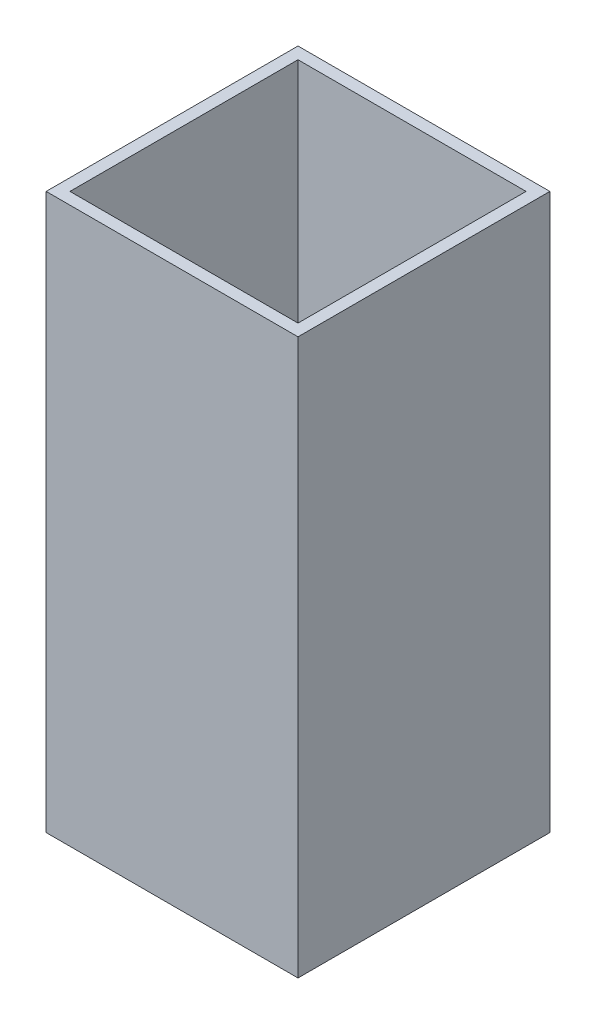
ISO-10303-21;
HEADER;
FILE_DESCRIPTION(('STEP AP214'),'2;1');
FILE_NAME('part.step','',(''),(''),'','','');
FILE_SCHEMA(('AUTOMOTIVE_DESIGN { 1 0 10303 214 1 1 1 1 }'));
ENDSEC;
DATA;
#1=APPLICATION_CONTEXT('core data for automotive mechanical design processes');
#2=APPLICATION_PROTOCOL_DEFINITION('international standard','automotive_design',2000,#1);
#3=PRODUCT_CONTEXT('',#1,'mechanical');
#4=PRODUCT('Part','Part','',(#3));
#5=PRODUCT_RELATED_PRODUCT_CATEGORY('part','',(#4));
#6=PRODUCT_DEFINITION_FORMATION('','',#4);
#7=PRODUCT_DEFINITION_CONTEXT('part definition',#1,'design');
#8=PRODUCT_DEFINITION('design','',#6,#7);
#9=PRODUCT_DEFINITION_SHAPE('','',#8);
#10=(LENGTH_UNIT() NAMED_UNIT(*) SI_UNIT(.MILLI.,.METRE.));
#11=(NAMED_UNIT(*) PLANE_ANGLE_UNIT() SI_UNIT($,.RADIAN.));
#12=(NAMED_UNIT(*) SI_UNIT($,.STERADIAN.) SOLID_ANGLE_UNIT());
#13=UNCERTAINTY_MEASURE_WITH_UNIT(LENGTH_MEASURE(1.E-05),#10,'distance_accuracy_value','');
#14=(GEOMETRIC_REPRESENTATION_CONTEXT(3) GLOBAL_UNCERTAINTY_ASSIGNED_CONTEXT((#13)) GLOBAL_UNIT_ASSIGNED_CONTEXT((#10,
#11,#12)) REPRESENTATION_CONTEXT('',''));
#15=CARTESIAN_POINT('',(0.,0.,0.));
#16=DIRECTION('',(0.,0.,1.));
#17=DIRECTION('',(1.,0.,0.));
#18=AXIS2_PLACEMENT_3D('',#15,#16,#17);
#19=CARTESIAN_POINT('',(0.,56.,0.));
#20=DIRECTION('',(0.,1.,0.));
#21=DIRECTION('',(0.,0.,1.));
#22=AXIS2_PLACEMENT_3D('',#19,#20,#21);
#23=PLANE('',#22);
#24=DIRECTION('',(0.,0.,1.));
#25=VECTOR('',#24,1.);
#26=CARTESIAN_POINT('',(-12.7,56.,12.7));
#27=LINE('',#26,#25);
#28=CARTESIAN_POINT('',(-12.7,56.,-12.7));
#29=VERTEX_POINT('',#28);
#30=CARTESIAN_POINT('',(-12.7,56.,12.7));
#31=VERTEX_POINT('',#30);
#32=EDGE_CURVE('E138',#29,#31,#27,.T.);
#33=ORIENTED_EDGE('',*,*,#32,.T.);
#34=DIRECTION('',(1.,0.,0.));
#35=VECTOR('',#34,1.);
#36=CARTESIAN_POINT('',(12.7,56.,12.7));
#37=LINE('',#36,#35);
#38=CARTESIAN_POINT('',(12.7,56.,12.7));
#39=VERTEX_POINT('',#38);
#40=EDGE_CURVE('E141',#31,#39,#37,.T.);
#41=ORIENTED_EDGE('',*,*,#40,.T.);
#42=DIRECTION('',(0.,0.,-1.));
#43=VECTOR('',#42,1.);
#44=CARTESIAN_POINT('',(12.7,56.,12.7));
#45=LINE('',#44,#43);
#46=CARTESIAN_POINT('',(12.7,56.,-12.7));
#47=VERTEX_POINT('',#46);
#48=EDGE_CURVE('E144',#39,#47,#45,.T.);
#49=ORIENTED_EDGE('',*,*,#48,.T.);
#50=DIRECTION('',(-1.,0.,0.));
#51=VECTOR('',#50,1.);
#52=CARTESIAN_POINT('',(12.7,56.,-12.7));
#53=LINE('',#52,#51);
#54=EDGE_CURVE('E146',#47,#29,#53,.T.);
#55=ORIENTED_EDGE('',*,*,#54,.T.);
#56=EDGE_LOOP('',(#33,#41,#49,#55));
#57=FACE_BOUND('',#56,.T.);
#58=DIRECTION('',(0.,0.,-1.));
#59=VECTOR('',#58,1.);
#60=CARTESIAN_POINT('',(11.5,56.,11.5));
#61=LINE('',#60,#59);
#62=CARTESIAN_POINT('',(11.5,56.,11.5));
#63=VERTEX_POINT('',#62);
#64=CARTESIAN_POINT('',(11.5,56.,-11.5));
#65=VERTEX_POINT('',#64);
#66=EDGE_CURVE('E110',#63,#65,#61,.T.);
#67=ORIENTED_EDGE('',*,*,#66,.F.);
#68=DIRECTION('',(1.,0.,0.));
#69=VECTOR('',#68,1.);
#70=CARTESIAN_POINT('',(11.5,56.,11.5));
#71=LINE('',#70,#69);
#72=CARTESIAN_POINT('',(-11.5,56.,11.5));
#73=VERTEX_POINT('',#72);
#74=EDGE_CURVE('E102',#73,#63,#71,.T.);
#75=ORIENTED_EDGE('',*,*,#74,.F.);
#76=DIRECTION('',(0.,0.,1.));
#77=VECTOR('',#76,1.);
#78=CARTESIAN_POINT('',(-11.5,56.,11.5));
#79=LINE('',#78,#77);
#80=CARTESIAN_POINT('',(-11.5,56.,-11.5));
#81=VERTEX_POINT('',#80);
#82=EDGE_CURVE('E124',#81,#73,#79,.T.);
#83=ORIENTED_EDGE('',*,*,#82,.F.);
#84=DIRECTION('',(-1.,0.,0.));
#85=VECTOR('',#84,1.);
#86=CARTESIAN_POINT('',(11.5,56.,-11.5));
#87=LINE('',#86,#85);
#88=EDGE_CURVE('E122',#65,#81,#87,.T.);
#89=ORIENTED_EDGE('',*,*,#88,.F.);
#90=EDGE_LOOP('',(#67,#75,#83,#89));
#91=FACE_BOUND('',#90,.T.);
#92=ADVANCED_FACE('F37',(#57,#91),#23,.T.);
#93=CARTESIAN_POINT('',(0.,0.,0.));
#94=DIRECTION('',(0.,1.,0.));
#95=DIRECTION('',(0.,0.,1.));
#96=AXIS2_PLACEMENT_3D('',#93,#94,#95);
#97=PLANE('',#96);
#98=DIRECTION('',(0.,0.,1.));
#99=VECTOR('',#98,1.);
#100=CARTESIAN_POINT('',(-12.7,0.,12.7));
#101=LINE('',#100,#99);
#102=CARTESIAN_POINT('',(-12.7,0.,-12.7));
#103=VERTEX_POINT('',#102);
#104=CARTESIAN_POINT('',(-12.7,0.,12.7));
#105=VERTEX_POINT('',#104);
#106=EDGE_CURVE('E118',#103,#105,#101,.T.);
#107=ORIENTED_EDGE('',*,*,#106,.F.);
#108=DIRECTION('',(-1.,0.,0.));
#109=VECTOR('',#108,1.);
#110=CARTESIAN_POINT('',(12.7,0.,-12.7));
#111=LINE('',#110,#109);
#112=CARTESIAN_POINT('',(12.7,0.,-12.7));
#113=VERTEX_POINT('',#112);
#114=EDGE_CURVE('E142',#113,#103,#111,.T.);
#115=ORIENTED_EDGE('',*,*,#114,.F.);
#116=DIRECTION('',(0.,0.,-1.));
#117=VECTOR('',#116,1.);
#118=CARTESIAN_POINT('',(12.7,0.,12.7));
#119=LINE('',#118,#117);
#120=CARTESIAN_POINT('',(12.7,0.,12.7));
#121=VERTEX_POINT('',#120);
#122=EDGE_CURVE('E153',#121,#113,#119,.T.);
#123=ORIENTED_EDGE('',*,*,#122,.F.);
#124=DIRECTION('',(1.,0.,0.));
#125=VECTOR('',#124,1.);
#126=CARTESIAN_POINT('',(12.7,0.,12.7));
#127=LINE('',#126,#125);
#128=EDGE_CURVE('E151',#105,#121,#127,.T.);
#129=ORIENTED_EDGE('',*,*,#128,.F.);
#130=EDGE_LOOP('',(#107,#115,#123,#129));
#131=FACE_BOUND('',#130,.T.);
#132=DIRECTION('',(1.,0.,0.));
#133=VECTOR('',#132,1.);
#134=CARTESIAN_POINT('',(11.5,0.,11.5));
#135=LINE('',#134,#133);
#136=CARTESIAN_POINT('',(-11.5,0.,11.5));
#137=VERTEX_POINT('',#136);
#138=CARTESIAN_POINT('',(11.5,0.,11.5));
#139=VERTEX_POINT('',#138);
#140=EDGE_CURVE('E60',#137,#139,#135,.T.);
#141=ORIENTED_EDGE('',*,*,#140,.T.);
#142=DIRECTION('',(0.,0.,-1.));
#143=VECTOR('',#142,1.);
#144=CARTESIAN_POINT('',(11.5,0.,11.5));
#145=LINE('',#144,#143);
#146=CARTESIAN_POINT('',(11.5,0.,-11.5));
#147=VERTEX_POINT('',#146);
#148=EDGE_CURVE('E117',#139,#147,#145,.T.);
#149=ORIENTED_EDGE('',*,*,#148,.T.);
#150=DIRECTION('',(-1.,0.,0.));
#151=VECTOR('',#150,1.);
#152=CARTESIAN_POINT('',(11.5,0.,-11.5));
#153=LINE('',#152,#151);
#154=CARTESIAN_POINT('',(-11.5,0.,-11.5));
#155=VERTEX_POINT('',#154);
#156=EDGE_CURVE('E130',#147,#155,#153,.T.);
#157=ORIENTED_EDGE('',*,*,#156,.T.);
#158=DIRECTION('',(0.,0.,1.));
#159=VECTOR('',#158,1.);
#160=CARTESIAN_POINT('',(-11.5,0.,11.5));
#161=LINE('',#160,#159);
#162=EDGE_CURVE('E111',#155,#137,#161,.T.);
#163=ORIENTED_EDGE('',*,*,#162,.T.);
#164=EDGE_LOOP('',(#141,#149,#157,#163));
#165=FACE_BOUND('',#164,.T.);
#166=ADVANCED_FACE('F171',(#131,#165),#97,.F.);
#167=CARTESIAN_POINT('',(-12.7,56.,12.7));
#168=DIRECTION('',(1.,0.,0.));
#169=DIRECTION('',(0.,0.,-1.));
#170=AXIS2_PLACEMENT_3D('',#167,#168,#169);
#171=PLANE('',#170);
#172=ORIENTED_EDGE('',*,*,#106,.T.);
#173=DIRECTION('',(0.,-1.,0.));
#174=VECTOR('',#173,1.);
#175=CARTESIAN_POINT('',(-12.7,56.,12.7));
#176=LINE('',#175,#174);
#177=EDGE_CURVE('E11',#31,#105,#176,.T.);
#178=ORIENTED_EDGE('',*,*,#177,.F.);
#179=ORIENTED_EDGE('',*,*,#32,.F.);
#180=DIRECTION('',(0.,-1.,0.));
#181=VECTOR('',#180,1.);
#182=CARTESIAN_POINT('',(-12.7,56.,-12.7));
#183=LINE('',#182,#181);
#184=EDGE_CURVE('E148',#29,#103,#183,.T.);
#185=ORIENTED_EDGE('',*,*,#184,.T.);
#186=EDGE_LOOP('',(#172,#178,#179,#185));
#187=FACE_BOUND('',#186,.T.);
#188=ADVANCED_FACE('F39',(#187),#171,.F.);
#189=CARTESIAN_POINT('',(12.7,56.,12.7));
#190=DIRECTION('',(0.,0.,-1.));
#191=DIRECTION('',(-1.,0.,0.));
#192=AXIS2_PLACEMENT_3D('',#189,#190,#191);
#193=PLANE('',#192);
#194=ORIENTED_EDGE('',*,*,#128,.T.);
#195=DIRECTION('',(0.,-1.,0.));
#196=VECTOR('',#195,1.);
#197=CARTESIAN_POINT('',(12.7,56.,12.7));
#198=LINE('',#197,#196);
#199=EDGE_CURVE('E45',#39,#121,#198,.T.);
#200=ORIENTED_EDGE('',*,*,#199,.F.);
#201=ORIENTED_EDGE('',*,*,#40,.F.);
#202=ORIENTED_EDGE('',*,*,#177,.T.);
#203=EDGE_LOOP('',(#194,#200,#201,#202));
#204=FACE_BOUND('',#203,.T.);
#205=ADVANCED_FACE('F181',(#204),#193,.F.);
#206=CARTESIAN_POINT('',(12.7,56.,12.7));
#207=DIRECTION('',(-1.,0.,0.));
#208=DIRECTION('',(0.,0.,1.));
#209=AXIS2_PLACEMENT_3D('',#206,#207,#208);
#210=PLANE('',#209);
#211=ORIENTED_EDGE('',*,*,#122,.T.);
#212=DIRECTION('',(0.,-1.,0.));
#213=VECTOR('',#212,1.);
#214=CARTESIAN_POINT('',(12.7,56.,-12.7));
#215=LINE('',#214,#213);
#216=EDGE_CURVE('E158',#47,#113,#215,.T.);
#217=ORIENTED_EDGE('',*,*,#216,.F.);
#218=ORIENTED_EDGE('',*,*,#48,.F.);
#219=ORIENTED_EDGE('',*,*,#199,.T.);
#220=EDGE_LOOP('',(#211,#217,#218,#219));
#221=FACE_BOUND('',#220,.T.);
#222=ADVANCED_FACE('F165',(#221),#210,.F.);
#223=CARTESIAN_POINT('',(12.7,56.,-12.7));
#224=DIRECTION('',(0.,0.,1.));
#225=DIRECTION('',(1.,0.,0.));
#226=AXIS2_PLACEMENT_3D('',#223,#224,#225);
#227=PLANE('',#226);
#228=ORIENTED_EDGE('',*,*,#114,.T.);
#229=ORIENTED_EDGE('',*,*,#184,.F.);
#230=ORIENTED_EDGE('',*,*,#54,.F.);
#231=ORIENTED_EDGE('',*,*,#216,.T.);
#232=EDGE_LOOP('',(#228,#229,#230,#231));
#233=FACE_BOUND('',#232,.T.);
#234=ADVANCED_FACE('F175',(#233),#227,.F.);
#235=CARTESIAN_POINT('',(11.5,56.,11.5));
#236=DIRECTION('',(0.,0.,-1.));
#237=DIRECTION('',(-1.,0.,0.));
#238=AXIS2_PLACEMENT_3D('',#235,#236,#237);
#239=PLANE('',#238);
#240=ORIENTED_EDGE('',*,*,#140,.F.);
#241=DIRECTION('',(0.,-1.,0.));
#242=VECTOR('',#241,1.);
#243=CARTESIAN_POINT('',(-11.5,56.,11.5));
#244=LINE('',#243,#242);
#245=EDGE_CURVE('E106',#73,#137,#244,.T.);
#246=ORIENTED_EDGE('',*,*,#245,.F.);
#247=ORIENTED_EDGE('',*,*,#74,.T.);
#248=DIRECTION('',(0.,-1.,0.));
#249=VECTOR('',#248,1.);
#250=CARTESIAN_POINT('',(11.5,56.,11.5));
#251=LINE('',#250,#249);
#252=EDGE_CURVE('E105',#63,#139,#251,.T.);
#253=ORIENTED_EDGE('',*,*,#252,.T.);
#254=EDGE_LOOP('',(#240,#246,#247,#253));
#255=FACE_BOUND('',#254,.T.);
#256=ADVANCED_FACE('F104',(#255),#239,.T.);
#257=CARTESIAN_POINT('',(11.5,56.,11.5));
#258=DIRECTION('',(-1.,0.,0.));
#259=DIRECTION('',(0.,0.,1.));
#260=AXIS2_PLACEMENT_3D('',#257,#258,#259);
#261=PLANE('',#260);
#262=ORIENTED_EDGE('',*,*,#148,.F.);
#263=ORIENTED_EDGE('',*,*,#252,.F.);
#264=ORIENTED_EDGE('',*,*,#66,.T.);
#265=DIRECTION('',(0.,-1.,0.));
#266=VECTOR('',#265,1.);
#267=CARTESIAN_POINT('',(11.5,56.,-11.5));
#268=LINE('',#267,#266);
#269=EDGE_CURVE('E119',#65,#147,#268,.T.);
#270=ORIENTED_EDGE('',*,*,#269,.T.);
#271=EDGE_LOOP('',(#262,#263,#264,#270));
#272=FACE_BOUND('',#271,.T.);
#273=ADVANCED_FACE('F114',(#272),#261,.T.);
#274=CARTESIAN_POINT('',(11.5,56.,-11.5));
#275=DIRECTION('',(0.,0.,1.));
#276=DIRECTION('',(1.,0.,0.));
#277=AXIS2_PLACEMENT_3D('',#274,#275,#276);
#278=PLANE('',#277);
#279=ORIENTED_EDGE('',*,*,#156,.F.);
#280=ORIENTED_EDGE('',*,*,#269,.F.);
#281=ORIENTED_EDGE('',*,*,#88,.T.);
#282=DIRECTION('',(0.,-1.,0.));
#283=VECTOR('',#282,1.);
#284=CARTESIAN_POINT('',(-11.5,56.,-11.5));
#285=LINE('',#284,#283);
#286=EDGE_CURVE('E52',#81,#155,#285,.T.);
#287=ORIENTED_EDGE('',*,*,#286,.T.);
#288=EDGE_LOOP('',(#279,#280,#281,#287));
#289=FACE_BOUND('',#288,.T.);
#290=ADVANCED_FACE('F204',(#289),#278,.T.);
#291=CARTESIAN_POINT('',(-11.5,56.,11.5));
#292=DIRECTION('',(1.,0.,0.));
#293=DIRECTION('',(0.,0.,-1.));
#294=AXIS2_PLACEMENT_3D('',#291,#292,#293);
#295=PLANE('',#294);
#296=ORIENTED_EDGE('',*,*,#162,.F.);
#297=ORIENTED_EDGE('',*,*,#286,.F.);
#298=ORIENTED_EDGE('',*,*,#82,.T.);
#299=ORIENTED_EDGE('',*,*,#245,.T.);
#300=EDGE_LOOP('',(#296,#297,#298,#299));
#301=FACE_BOUND('',#300,.T.);
#302=ADVANCED_FACE('F208',(#301),#295,.T.);
#303=CLOSED_SHELL('',(#92,#166,#188,#205,#222,#234,#256,#273,#290,#302));
#304=MANIFOLD_SOLID_BREP('B2',#303);
#305=ADVANCED_BREP_SHAPE_REPRESENTATION('',(#18,#304),#14);
#306=SHAPE_DEFINITION_REPRESENTATION(#9,#305);
ENDSEC;
END-ISO-10303-21;
